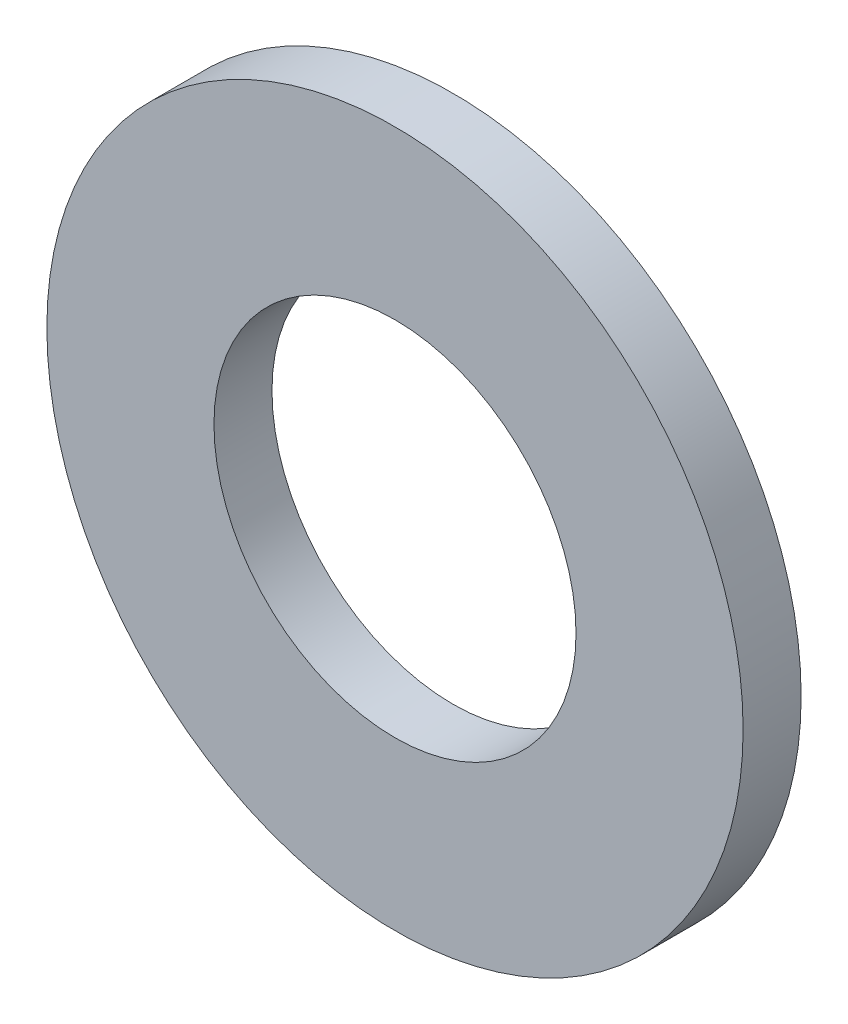
ISO-10303-21;
HEADER;
FILE_DESCRIPTION(('STEP AP214'),'2;1');
FILE_NAME('part.step','',(''),(''),'','','');
FILE_SCHEMA(('AUTOMOTIVE_DESIGN { 1 0 10303 214 1 1 1 1 }'));
ENDSEC;
DATA;
#1=APPLICATION_CONTEXT('core data for automotive mechanical design processes');
#2=APPLICATION_PROTOCOL_DEFINITION('international standard','automotive_design',2000,#1);
#3=PRODUCT_CONTEXT('',#1,'mechanical');
#4=PRODUCT('Part','Part','',(#3));
#5=PRODUCT_RELATED_PRODUCT_CATEGORY('part','',(#4));
#6=PRODUCT_DEFINITION_FORMATION('','',#4);
#7=PRODUCT_DEFINITION_CONTEXT('part definition',#1,'design');
#8=PRODUCT_DEFINITION('design','',#6,#7);
#9=PRODUCT_DEFINITION_SHAPE('','',#8);
#10=(LENGTH_UNIT() NAMED_UNIT(*) SI_UNIT(.MILLI.,.METRE.));
#11=(NAMED_UNIT(*) PLANE_ANGLE_UNIT() SI_UNIT($,.RADIAN.));
#12=(NAMED_UNIT(*) SI_UNIT($,.STERADIAN.) SOLID_ANGLE_UNIT());
#13=UNCERTAINTY_MEASURE_WITH_UNIT(LENGTH_MEASURE(1.E-05),#10,'distance_accuracy_value','');
#14=(GEOMETRIC_REPRESENTATION_CONTEXT(3) GLOBAL_UNCERTAINTY_ASSIGNED_CONTEXT((#13)) GLOBAL_UNIT_ASSIGNED_CONTEXT((#10,
#11,#12)) REPRESENTATION_CONTEXT('',''));
#15=CARTESIAN_POINT('',(0.,0.,0.));
#16=DIRECTION('',(0.,0.,1.));
#17=DIRECTION('',(1.,0.,0.));
#18=AXIS2_PLACEMENT_3D('',#15,#16,#17);
#19=CARTESIAN_POINT('',(0.,-21.0964213562373,0.));
#20=DIRECTION('',(0.,0.,1.));
#21=DIRECTION('',(1.,0.,0.));
#22=AXIS2_PLACEMENT_3D('',#19,#20,#21);
#23=PLANE('',#22);
#24=CARTESIAN_POINT('',(0.,0.,0.));
#25=DIRECTION('',(0.,0.,-1.));
#26=DIRECTION('',(-1.,0.,0.));
#27=AXIS2_PLACEMENT_3D('',#24,#25,#26);
#28=CIRCLE('',#27,9.525);
#29=CARTESIAN_POINT('',(-9.525,0.,0.));
#30=VERTEX_POINT('',#29);
#31=EDGE_CURVE('E27',#30,#30,#28,.F.);
#32=ORIENTED_EDGE('',*,*,#31,.F.);
#33=EDGE_LOOP('',(#32));
#34=FACE_BOUND('',#33,.T.);
#35=CARTESIAN_POINT('',(0.,0.,0.));
#36=DIRECTION('',(0.,0.,-1.));
#37=DIRECTION('',(-1.,0.,0.));
#38=AXIS2_PLACEMENT_3D('',#35,#36,#37);
#39=CIRCLE('',#38,4.953);
#40=CARTESIAN_POINT('',(-4.953,0.,0.));
#41=VERTEX_POINT('',#40);
#42=EDGE_CURVE('E18',#41,#41,#39,.F.);
#43=ORIENTED_EDGE('',*,*,#42,.T.);
#44=EDGE_LOOP('',(#43));
#45=FACE_BOUND('',#44,.T.);
#46=ADVANCED_FACE('F15',(#34,#45),#23,.F.);
#47=CARTESIAN_POINT('',(0.,0.,1.5875));
#48=DIRECTION('',(0.,0.,-1.));
#49=DIRECTION('',(-1.,0.,0.));
#50=AXIS2_PLACEMENT_3D('',#47,#48,#49);
#51=CYLINDRICAL_SURFACE('',#50,4.953);
#52=CARTESIAN_POINT('',(0.,0.,1.5875));
#53=DIRECTION('',(0.,0.,-1.));
#54=DIRECTION('',(-1.,0.,0.));
#55=AXIS2_PLACEMENT_3D('',#52,#53,#54);
#56=CIRCLE('',#55,4.953);
#57=CARTESIAN_POINT('',(-4.953,0.,1.5875));
#58=VERTEX_POINT('',#57);
#59=EDGE_CURVE('E22',#58,#58,#56,.T.);
#60=ORIENTED_EDGE('',*,*,#59,.F.);
#61=EDGE_LOOP('',(#60));
#62=FACE_BOUND('',#61,.T.);
#63=ORIENTED_EDGE('',*,*,#42,.F.);
#64=EDGE_LOOP('',(#63));
#65=FACE_BOUND('',#64,.T.);
#66=ADVANCED_FACE('F36',(#62,#65),#51,.F.);
#67=CARTESIAN_POINT('',(0.,0.,1.5875));
#68=DIRECTION('',(0.,0.,-1.));
#69=DIRECTION('',(-1.,0.,0.));
#70=AXIS2_PLACEMENT_3D('',#67,#68,#69);
#71=CYLINDRICAL_SURFACE('',#70,9.525);
#72=ORIENTED_EDGE('',*,*,#31,.T.);
#73=EDGE_LOOP('',(#72));
#74=FACE_BOUND('',#73,.T.);
#75=CARTESIAN_POINT('',(0.,0.,1.5875));
#76=DIRECTION('',(0.,0.,-1.));
#77=DIRECTION('',(-1.,0.,0.));
#78=AXIS2_PLACEMENT_3D('',#75,#76,#77);
#79=CIRCLE('',#78,9.525);
#80=CARTESIAN_POINT('',(-9.525,0.,1.5875));
#81=VERTEX_POINT('',#80);
#82=EDGE_CURVE('E10',#81,#81,#79,.F.);
#83=ORIENTED_EDGE('',*,*,#82,.F.);
#84=EDGE_LOOP('',(#83));
#85=FACE_BOUND('',#84,.T.);
#86=ADVANCED_FACE('F38',(#74,#85),#71,.T.);
#87=CARTESIAN_POINT('',(0.,-21.0964213562373,1.5875));
#88=DIRECTION('',(0.,0.,1.));
#89=DIRECTION('',(1.,0.,0.));
#90=AXIS2_PLACEMENT_3D('',#87,#88,#89);
#91=PLANE('',#90);
#92=ORIENTED_EDGE('',*,*,#82,.T.);
#93=EDGE_LOOP('',(#92));
#94=FACE_BOUND('',#93,.T.);
#95=ORIENTED_EDGE('',*,*,#59,.T.);
#96=EDGE_LOOP('',(#95));
#97=FACE_BOUND('',#96,.T.);
#98=ADVANCED_FACE('F45',(#94,#97),#91,.T.);
#99=CLOSED_SHELL('',(#46,#66,#86,#98));
#100=MANIFOLD_SOLID_BREP('B1',#99);
#101=ADVANCED_BREP_SHAPE_REPRESENTATION('',(#18,#100),#14);
#102=SHAPE_DEFINITION_REPRESENTATION(#9,#101);
ENDSEC;
END-ISO-10303-21;
